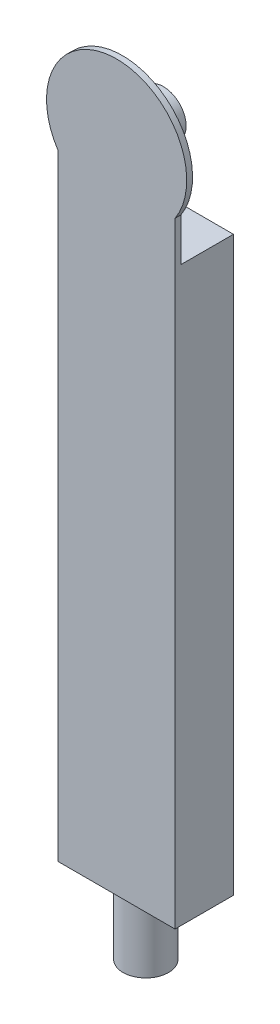
ISO-10303-21;
HEADER;
FILE_DESCRIPTION(('STEP AP214'),'2;1');
FILE_NAME('part.step','',(''),(''),'','','');
FILE_SCHEMA(('AUTOMOTIVE_DESIGN { 1 0 10303 214 1 1 1 1 }'));
ENDSEC;
DATA;
#1=APPLICATION_CONTEXT('core data for automotive mechanical design processes');
#2=APPLICATION_PROTOCOL_DEFINITION('international standard','automotive_design',2000,#1);
#3=PRODUCT_CONTEXT('',#1,'mechanical');
#4=PRODUCT('Part','Part','',(#3));
#5=PRODUCT_RELATED_PRODUCT_CATEGORY('part','',(#4));
#6=PRODUCT_DEFINITION_FORMATION('','',#4);
#7=PRODUCT_DEFINITION_CONTEXT('part definition',#1,'design');
#8=PRODUCT_DEFINITION('design','',#6,#7);
#9=PRODUCT_DEFINITION_SHAPE('','',#8);
#10=(LENGTH_UNIT() NAMED_UNIT(*) SI_UNIT(.MILLI.,.METRE.));
#11=(NAMED_UNIT(*) PLANE_ANGLE_UNIT() SI_UNIT($,.RADIAN.));
#12=(NAMED_UNIT(*) SI_UNIT($,.STERADIAN.) SOLID_ANGLE_UNIT());
#13=UNCERTAINTY_MEASURE_WITH_UNIT(LENGTH_MEASURE(1.E-05),#10,'distance_accuracy_value','');
#14=(GEOMETRIC_REPRESENTATION_CONTEXT(3) GLOBAL_UNCERTAINTY_ASSIGNED_CONTEXT((#13)) GLOBAL_UNIT_ASSIGNED_CONTEXT((#10,
#11,#12)) REPRESENTATION_CONTEXT('',''));
#15=CARTESIAN_POINT('',(0.,0.,0.));
#16=DIRECTION('',(0.,0.,1.));
#17=DIRECTION('',(1.,0.,0.));
#18=AXIS2_PLACEMENT_3D('',#15,#16,#17);
#19=CARTESIAN_POINT('',(-52.5773195876288,96.3917525773196,10.));
#20=DIRECTION('',(1.,0.,0.));
#21=DIRECTION('',(0.,1.,0.));
#22=AXIS2_PLACEMENT_3D('',#19,#20,#21);
#23=PLANE('',#22);
#24=DIRECTION('',(0.,-1.,0.));
#25=VECTOR('',#24,1.);
#26=CARTESIAN_POINT('',(-52.5773195876288,96.3917525773196,9.));
#27=LINE('',#26,#25);
#28=CARTESIAN_POINT('',(-52.5773195876288,101.758502996609,9.));
#29=VERTEX_POINT('',#28);
#30=CARTESIAN_POINT('',(-52.5773195876288,94.3917525773196,9.));
#31=VERTEX_POINT('',#30);
#32=EDGE_CURVE('E108',#29,#31,#27,.T.);
#33=ORIENTED_EDGE('',*,*,#32,.T.);
#34=DIRECTION('',(0.,0.,-1.));
#35=VECTOR('',#34,1.);
#36=CARTESIAN_POINT('',(-52.5773195876288,94.3917525773196,29.0997512422418));
#37=LINE('',#36,#35);
#38=CARTESIAN_POINT('',(-52.5773195876288,94.3917525773196,0.));
#39=VERTEX_POINT('',#38);
#40=EDGE_CURVE('E140',#31,#39,#37,.T.);
#41=ORIENTED_EDGE('',*,*,#40,.T.);
#42=DIRECTION('',(0.,-1.,0.));
#43=VECTOR('',#42,1.);
#44=CARTESIAN_POINT('',(-52.5773195876288,96.3917525773196,0.));
#45=LINE('',#44,#43);
#46=CARTESIAN_POINT('',(-52.5773195876288,-3.6082474226804,0.));
#47=VERTEX_POINT('',#46);
#48=EDGE_CURVE('E61',#39,#47,#45,.T.);
#49=ORIENTED_EDGE('',*,*,#48,.T.);
#50=DIRECTION('',(0.,0.,-1.));
#51=VECTOR('',#50,1.);
#52=CARTESIAN_POINT('',(-52.5773195876288,-3.6082474226804,10.));
#53=LINE('',#52,#51);
#54=CARTESIAN_POINT('',(-52.5773195876288,-3.6082474226804,10.));
#55=VERTEX_POINT('',#54);
#56=EDGE_CURVE('E81',#55,#47,#53,.T.);
#57=ORIENTED_EDGE('',*,*,#56,.F.);
#58=DIRECTION('',(0.,-1.,0.));
#59=VECTOR('',#58,1.);
#60=CARTESIAN_POINT('',(-52.5773195876288,96.3917525773196,10.));
#61=LINE('',#60,#59);
#62=CARTESIAN_POINT('',(-52.5773195876288,101.758502996609,10.));
#63=VERTEX_POINT('',#62);
#64=EDGE_CURVE('E79',#63,#55,#61,.T.);
#65=ORIENTED_EDGE('',*,*,#64,.F.);
#66=DIRECTION('',(0.,0.,1.));
#67=VECTOR('',#66,1.);
#68=CARTESIAN_POINT('',(-52.5773195876288,101.758502996609,9.));
#69=LINE('',#68,#67);
#70=EDGE_CURVE('E70',#29,#63,#69,.T.);
#71=ORIENTED_EDGE('',*,*,#70,.F.);
#72=EDGE_LOOP('',(#33,#41,#49,#57,#65,#71));
#73=FACE_BOUND('',#72,.T.);
#74=ADVANCED_FACE('F34',(#73),#23,.F.);
#75=CARTESIAN_POINT('',(-52.5773195876288,-3.6082474226804,10.));
#76=DIRECTION('',(0.,1.,0.));
#77=DIRECTION('',(0.,0.,1.));
#78=AXIS2_PLACEMENT_3D('',#75,#76,#77);
#79=PLANE('',#78);
#80=CARTESIAN_POINT('',(-42.5773195876288,-3.6082474226804,5.));
#81=DIRECTION('',(0.,-1.,0.));
#82=DIRECTION('',(0.,0.,-1.));
#83=AXIS2_PLACEMENT_3D('',#80,#81,#82);
#84=CIRCLE('',#83,3.9);
#85=CARTESIAN_POINT('',(-42.5773195876288,-3.6082474226804,1.1));
#86=VERTEX_POINT('',#85);
#87=EDGE_CURVE('E42',#86,#86,#84,.T.);
#88=ORIENTED_EDGE('',*,*,#87,.F.);
#89=EDGE_LOOP('',(#88));
#90=FACE_BOUND('',#89,.T.);
#91=DIRECTION('',(1.,0.,0.));
#92=VECTOR('',#91,1.);
#93=CARTESIAN_POINT('',(-52.5773195876288,-3.6082474226804,0.));
#94=LINE('',#93,#92);
#95=CARTESIAN_POINT('',(-32.5773195876288,-3.6082474226804,0.));
#96=VERTEX_POINT('',#95);
#97=EDGE_CURVE('E120',#47,#96,#94,.T.);
#98=ORIENTED_EDGE('',*,*,#97,.T.);
#99=DIRECTION('',(0.,0.,-1.));
#100=VECTOR('',#99,1.);
#101=CARTESIAN_POINT('',(-32.5773195876288,-3.6082474226804,10.));
#102=LINE('',#101,#100);
#103=CARTESIAN_POINT('',(-32.5773195876288,-3.6082474226804,10.));
#104=VERTEX_POINT('',#103);
#105=EDGE_CURVE('E118',#104,#96,#102,.T.);
#106=ORIENTED_EDGE('',*,*,#105,.F.);
#107=DIRECTION('',(1.,0.,0.));
#108=VECTOR('',#107,1.);
#109=CARTESIAN_POINT('',(-52.5773195876288,-3.6082474226804,10.));
#110=LINE('',#109,#108);
#111=EDGE_CURVE('E50',#55,#104,#110,.T.);
#112=ORIENTED_EDGE('',*,*,#111,.F.);
#113=ORIENTED_EDGE('',*,*,#56,.T.);
#114=EDGE_LOOP('',(#98,#106,#112,#113));
#115=FACE_BOUND('',#114,.T.);
#116=ADVANCED_FACE('F126',(#90,#115),#79,.F.);
#117=CARTESIAN_POINT('',(-32.5773195876288,96.3917525773196,10.));
#118=DIRECTION('',(-1.,0.,0.));
#119=DIRECTION('',(0.,-1.,0.));
#120=AXIS2_PLACEMENT_3D('',#117,#118,#119);
#121=PLANE('',#120);
#122=DIRECTION('',(0.,0.,-1.));
#123=VECTOR('',#122,1.);
#124=CARTESIAN_POINT('',(-32.5773195876288,94.3917525773196,29.0997512422418));
#125=LINE('',#124,#123);
#126=CARTESIAN_POINT('',(-32.5773195876288,94.3917525773196,9.));
#127=VERTEX_POINT('',#126);
#128=CARTESIAN_POINT('',(-32.5773195876288,94.3917525773196,0.));
#129=VERTEX_POINT('',#128);
#130=EDGE_CURVE('E105',#127,#129,#125,.T.);
#131=ORIENTED_EDGE('',*,*,#130,.F.);
#132=DIRECTION('',(0.,1.,0.));
#133=VECTOR('',#132,1.);
#134=CARTESIAN_POINT('',(-32.5773195876288,96.3917525773196,9.));
#135=LINE('',#134,#133);
#136=CARTESIAN_POINT('',(-32.5773195876288,101.758502996609,9.));
#137=VERTEX_POINT('',#136);
#138=EDGE_CURVE('E99',#127,#137,#135,.T.);
#139=ORIENTED_EDGE('',*,*,#138,.T.);
#140=DIRECTION('',(0.,0.,1.));
#141=VECTOR('',#140,1.);
#142=CARTESIAN_POINT('',(-32.5773195876288,101.758502996609,9.));
#143=LINE('',#142,#141);
#144=CARTESIAN_POINT('',(-32.5773195876288,101.758502996609,10.));
#145=VERTEX_POINT('',#144);
#146=EDGE_CURVE('E93',#137,#145,#143,.T.);
#147=ORIENTED_EDGE('',*,*,#146,.T.);
#148=DIRECTION('',(0.,1.,0.));
#149=VECTOR('',#148,1.);
#150=CARTESIAN_POINT('',(-32.5773195876288,96.3917525773196,10.));
#151=LINE('',#150,#149);
#152=EDGE_CURVE('E97',#104,#145,#151,.T.);
#153=ORIENTED_EDGE('',*,*,#152,.F.);
#154=ORIENTED_EDGE('',*,*,#105,.T.);
#155=DIRECTION('',(0.,1.,0.));
#156=VECTOR('',#155,1.);
#157=CARTESIAN_POINT('',(-32.5773195876288,96.3917525773196,0.));
#158=LINE('',#157,#156);
#159=EDGE_CURVE('E83',#96,#129,#158,.T.);
#160=ORIENTED_EDGE('',*,*,#159,.T.);
#161=EDGE_LOOP('',(#131,#139,#147,#153,#154,#160));
#162=FACE_BOUND('',#161,.T.);
#163=ADVANCED_FACE('F130',(#162),#121,.F.);
#164=CARTESIAN_POINT('',(0.,0.,10.));
#165=DIRECTION('',(0.,0.,1.));
#166=DIRECTION('',(1.,0.,0.));
#167=AXIS2_PLACEMENT_3D('',#164,#165,#166);
#168=PLANE('',#167);
#169=ORIENTED_EDGE('',*,*,#64,.T.);
#170=ORIENTED_EDGE('',*,*,#111,.T.);
#171=ORIENTED_EDGE('',*,*,#152,.T.);
#172=CARTESIAN_POINT('',(-42.5773195876288,108.39175257732,10.));
#173=DIRECTION('',(0.,0.,1.));
#174=DIRECTION('',(1.,0.,0.));
#175=AXIS2_PLACEMENT_3D('',#172,#173,#174);
#176=CIRCLE('',#175,12.);
#177=EDGE_CURVE('E88',#145,#63,#176,.T.);
#178=ORIENTED_EDGE('',*,*,#177,.T.);
#179=EDGE_LOOP('',(#169,#170,#171,#178));
#180=FACE_BOUND('',#179,.T.);
#181=ADVANCED_FACE('F95',(#180),#168,.T.);
#182=CARTESIAN_POINT('',(0.,0.,0.));
#183=DIRECTION('',(0.,0.,1.));
#184=DIRECTION('',(1.,0.,0.));
#185=AXIS2_PLACEMENT_3D('',#182,#183,#184);
#186=PLANE('',#185);
#187=ORIENTED_EDGE('',*,*,#48,.F.);
#188=DIRECTION('',(-1.,0.,0.));
#189=VECTOR('',#188,1.);
#190=CARTESIAN_POINT('',(-32.5773195876288,94.3917525773196,0.));
#191=LINE('',#190,#189);
#192=EDGE_CURVE('E144',#129,#39,#191,.T.);
#193=ORIENTED_EDGE('',*,*,#192,.F.);
#194=ORIENTED_EDGE('',*,*,#159,.F.);
#195=ORIENTED_EDGE('',*,*,#97,.F.);
#196=EDGE_LOOP('',(#187,#193,#194,#195));
#197=FACE_BOUND('',#196,.T.);
#198=ADVANCED_FACE('F154',(#197),#186,.F.);
#199=CARTESIAN_POINT('',(-42.5773195876288,-15.6082474226804,5.));
#200=DIRECTION('',(0.,1.,0.));
#201=DIRECTION('',(0.,0.,1.));
#202=AXIS2_PLACEMENT_3D('',#199,#200,#201);
#203=CYLINDRICAL_SURFACE('',#202,3.9);
#204=CARTESIAN_POINT('',(-42.5773195876288,-15.6082474226804,5.));
#205=DIRECTION('',(0.,-1.,0.));
#206=DIRECTION('',(0.,0.,-1.));
#207=AXIS2_PLACEMENT_3D('',#204,#205,#206);
#208=CIRCLE('',#207,3.9);
#209=CARTESIAN_POINT('',(-42.5773195876288,-15.6082474226804,1.1));
#210=VERTEX_POINT('',#209);
#211=EDGE_CURVE('E92',#210,#210,#208,.T.);
#212=ORIENTED_EDGE('',*,*,#211,.F.);
#213=EDGE_LOOP('',(#212));
#214=FACE_BOUND('',#213,.T.);
#215=ORIENTED_EDGE('',*,*,#87,.T.);
#216=EDGE_LOOP('',(#215));
#217=FACE_BOUND('',#216,.T.);
#218=ADVANCED_FACE('F158',(#214,#217),#203,.T.);
#219=CARTESIAN_POINT('',(-42.5773195876288,-15.6082474226804,5.));
#220=DIRECTION('',(0.,-1.,0.));
#221=DIRECTION('',(0.,0.,-1.));
#222=AXIS2_PLACEMENT_3D('',#219,#220,#221);
#223=PLANE('',#222);
#224=ORIENTED_EDGE('',*,*,#211,.T.);
#225=EDGE_LOOP('',(#224));
#226=FACE_BOUND('',#225,.T.);
#227=ADVANCED_FACE('F164',(#226),#223,.T.);
#228=CARTESIAN_POINT('',(-42.5773195876288,108.39175257732,9.));
#229=DIRECTION('',(0.,0.,1.));
#230=DIRECTION('',(1.,0.,0.));
#231=AXIS2_PLACEMENT_3D('',#228,#229,#230);
#232=CYLINDRICAL_SURFACE('',#231,12.);
#233=ORIENTED_EDGE('',*,*,#177,.F.);
#234=ORIENTED_EDGE('',*,*,#146,.F.);
#235=CARTESIAN_POINT('',(-42.5773195876288,108.39175257732,9.));
#236=DIRECTION('',(0.,0.,1.));
#237=DIRECTION('',(1.,0.,0.));
#238=AXIS2_PLACEMENT_3D('',#235,#236,#237);
#239=CIRCLE('',#238,12.);
#240=EDGE_CURVE('E90',#137,#29,#239,.T.);
#241=ORIENTED_EDGE('',*,*,#240,.T.);
#242=ORIENTED_EDGE('',*,*,#70,.T.);
#243=EDGE_LOOP('',(#233,#234,#241,#242));
#244=FACE_BOUND('',#243,.T.);
#245=ADVANCED_FACE('F87',(#244),#232,.T.);
#246=CARTESIAN_POINT('',(-42.5773195876288,108.39175257732,9.));
#247=DIRECTION('',(0.,0.,1.));
#248=DIRECTION('',(1.,0.,0.));
#249=AXIS2_PLACEMENT_3D('',#246,#247,#248);
#250=PLANE('',#249);
#251=CARTESIAN_POINT('',(-42.5773195876288,108.39175257732,9.));
#252=DIRECTION('',(0.,0.,1.));
#253=DIRECTION('',(1.,0.,0.));
#254=AXIS2_PLACEMENT_3D('',#251,#252,#253);
#255=CIRCLE('',#254,3.9);
#256=CARTESIAN_POINT('',(-38.6773195876288,108.39175257732,9.));
#257=VERTEX_POINT('',#256);
#258=EDGE_CURVE('E11',#257,#257,#255,.F.);
#259=ORIENTED_EDGE('',*,*,#258,.F.);
#260=EDGE_LOOP('',(#259));
#261=FACE_BOUND('',#260,.T.);
#262=ORIENTED_EDGE('',*,*,#138,.F.);
#263=DIRECTION('',(-1.,0.,0.));
#264=VECTOR('',#263,1.);
#265=CARTESIAN_POINT('',(-32.5773195876288,94.3917525773196,9.));
#266=LINE('',#265,#264);
#267=EDGE_CURVE('E142',#127,#31,#266,.T.);
#268=ORIENTED_EDGE('',*,*,#267,.T.);
#269=ORIENTED_EDGE('',*,*,#32,.F.);
#270=ORIENTED_EDGE('',*,*,#240,.F.);
#271=EDGE_LOOP('',(#262,#268,#269,#270));
#272=FACE_BOUND('',#271,.T.);
#273=ADVANCED_FACE('F133',(#261,#272),#250,.F.);
#274=CARTESIAN_POINT('',(-42.5773195876288,108.39175257732,2.));
#275=DIRECTION('',(0.,0.,1.));
#276=DIRECTION('',(1.,0.,0.));
#277=AXIS2_PLACEMENT_3D('',#274,#275,#276);
#278=CYLINDRICAL_SURFACE('',#277,3.9);
#279=CARTESIAN_POINT('',(-42.5773195876288,108.39175257732,2.));
#280=DIRECTION('',(0.,0.,-1.));
#281=DIRECTION('',(-1.,0.,0.));
#282=AXIS2_PLACEMENT_3D('',#279,#280,#281);
#283=CIRCLE('',#282,3.9);
#284=CARTESIAN_POINT('',(-46.4773195876288,108.39175257732,2.));
#285=VERTEX_POINT('',#284);
#286=EDGE_CURVE('E100',#285,#285,#283,.T.);
#287=ORIENTED_EDGE('',*,*,#286,.F.);
#288=EDGE_LOOP('',(#287));
#289=FACE_BOUND('',#288,.T.);
#290=ORIENTED_EDGE('',*,*,#258,.T.);
#291=EDGE_LOOP('',(#290));
#292=FACE_BOUND('',#291,.T.);
#293=ADVANCED_FACE('F206',(#289,#292),#278,.T.);
#294=CARTESIAN_POINT('',(-42.5773195876288,108.39175257732,2.));
#295=DIRECTION('',(0.,0.,-1.));
#296=DIRECTION('',(-1.,0.,0.));
#297=AXIS2_PLACEMENT_3D('',#294,#295,#296);
#298=PLANE('',#297);
#299=ORIENTED_EDGE('',*,*,#286,.T.);
#300=EDGE_LOOP('',(#299));
#301=FACE_BOUND('',#300,.T.);
#302=ADVANCED_FACE('F211',(#301),#298,.T.);
#303=CARTESIAN_POINT('',(-32.5773195876288,94.3917525773196,29.0997512422418));
#304=DIRECTION('',(0.,-1.,0.));
#305=DIRECTION('',(0.,0.,-1.));
#306=AXIS2_PLACEMENT_3D('',#303,#304,#305);
#307=PLANE('',#306);
#308=ORIENTED_EDGE('',*,*,#130,.T.);
#309=ORIENTED_EDGE('',*,*,#192,.T.);
#310=ORIENTED_EDGE('',*,*,#40,.F.);
#311=ORIENTED_EDGE('',*,*,#267,.F.);
#312=EDGE_LOOP('',(#308,#309,#310,#311));
#313=FACE_BOUND('',#312,.T.);
#314=ADVANCED_FACE('F150',(#313),#307,.F.);
#315=CLOSED_SHELL('',(#74,#116,#163,#181,#198,#218,#227,#245,#273,#293,#302,#314));
#316=MANIFOLD_SOLID_BREP('B2',#315);
#317=ADVANCED_BREP_SHAPE_REPRESENTATION('',(#18,#316),#14);
#318=SHAPE_DEFINITION_REPRESENTATION(#9,#317);
ENDSEC;
END-ISO-10303-21;
